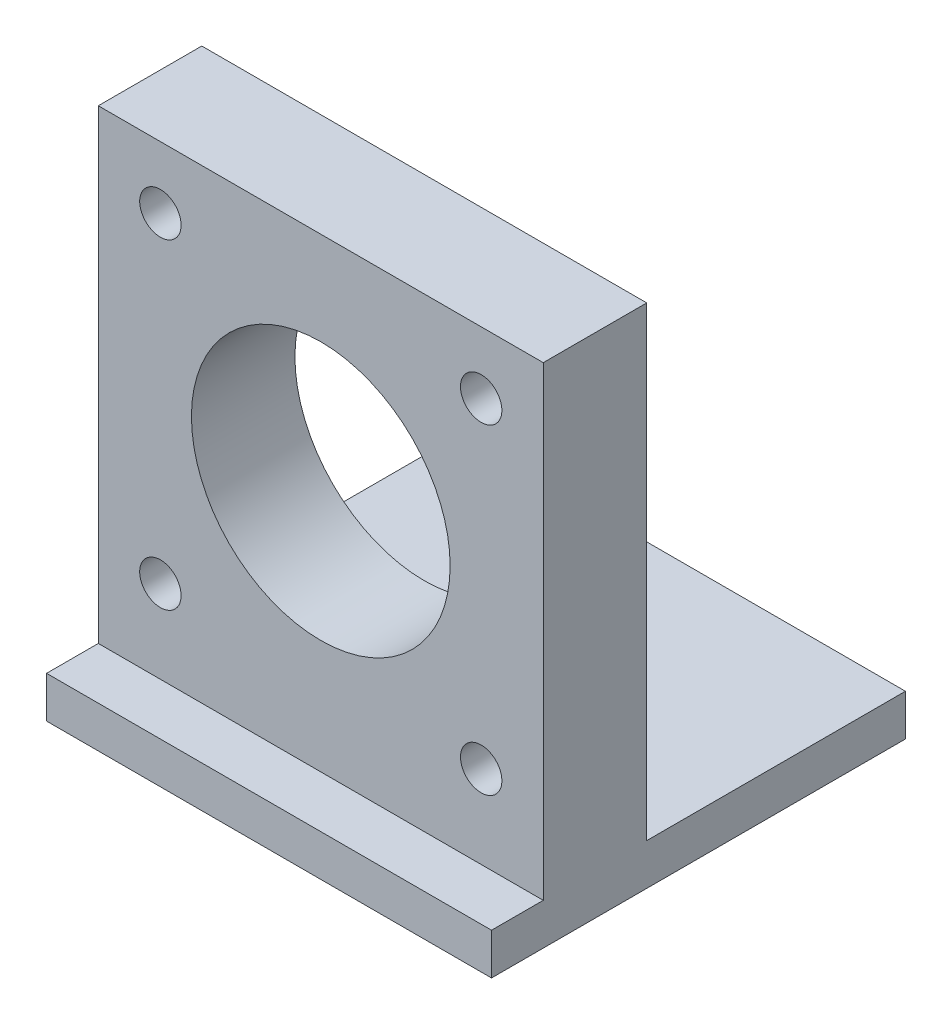
ISO-10303-21;
HEADER;
FILE_DESCRIPTION(('STEP AP214'),'2;1');
FILE_NAME('part.step','',(''),(''),'','','');
FILE_SCHEMA(('AUTOMOTIVE_DESIGN { 1 0 10303 214 1 1 1 1 }'));
ENDSEC;
DATA;
#1=APPLICATION_CONTEXT('core data for automotive mechanical design processes');
#2=APPLICATION_PROTOCOL_DEFINITION('international standard','automotive_design',2000,#1);
#3=PRODUCT_CONTEXT('',#1,'mechanical');
#4=PRODUCT('Part','Part','',(#3));
#5=PRODUCT_RELATED_PRODUCT_CATEGORY('part','',(#4));
#6=PRODUCT_DEFINITION_FORMATION('','',#4);
#7=PRODUCT_DEFINITION_CONTEXT('part definition',#1,'design');
#8=PRODUCT_DEFINITION('design','',#6,#7);
#9=PRODUCT_DEFINITION_SHAPE('','',#8);
#10=(LENGTH_UNIT() NAMED_UNIT(*) SI_UNIT(.MILLI.,.METRE.));
#11=(NAMED_UNIT(*) PLANE_ANGLE_UNIT() SI_UNIT($,.RADIAN.));
#12=(NAMED_UNIT(*) SI_UNIT($,.STERADIAN.) SOLID_ANGLE_UNIT());
#13=UNCERTAINTY_MEASURE_WITH_UNIT(LENGTH_MEASURE(1.E-05),#10,'distance_accuracy_value','');
#14=(GEOMETRIC_REPRESENTATION_CONTEXT(3) GLOBAL_UNCERTAINTY_ASSIGNED_CONTEXT((#13)) GLOBAL_UNIT_ASSIGNED_CONTEXT((#10,
#11,#12)) REPRESENTATION_CONTEXT('',''));
#15=CARTESIAN_POINT('',(0.,0.,0.));
#16=DIRECTION('',(0.,0.,1.));
#17=DIRECTION('',(1.,0.,0.));
#18=AXIS2_PLACEMENT_3D('',#15,#16,#17);
#19=CARTESIAN_POINT('',(0.,4.,0.));
#20=DIRECTION('',(0.,-1.,0.));
#21=DIRECTION('',(0.,0.,-1.));
#22=AXIS2_PLACEMENT_3D('',#19,#20,#21);
#23=PLANE('',#22);
#24=DIRECTION('',(-1.,0.,0.));
#25=VECTOR('',#24,1.);
#26=CARTESIAN_POINT('',(-27.0906484761589,4.,-0.669439574205802));
#27=LINE('',#26,#25);
#28=CARTESIAN_POINT('',(15.9093515238411,4.,-0.669439574205802));
#29=VERTEX_POINT('',#28);
#30=CARTESIAN_POINT('',(-27.0906484761589,4.,-0.669439574205802));
#31=VERTEX_POINT('',#30);
#32=EDGE_CURVE('E50',#29,#31,#27,.T.);
#33=ORIENTED_EDGE('',*,*,#32,.F.);
#34=DIRECTION('',(0.,0.,-1.));
#35=VECTOR('',#34,1.);
#36=CARTESIAN_POINT('',(15.9093515238411,4.,14.3305604257942));
#37=LINE('',#36,#35);
#38=CARTESIAN_POINT('',(15.9093515238411,4.,-25.6694395742058));
#39=VERTEX_POINT('',#38);
#40=EDGE_CURVE('E171',#29,#39,#37,.T.);
#41=ORIENTED_EDGE('',*,*,#40,.T.);
#42=DIRECTION('',(-1.,0.,0.));
#43=VECTOR('',#42,1.);
#44=CARTESIAN_POINT('',(-27.0906484761589,4.,-25.6694395742058));
#45=LINE('',#44,#43);
#46=CARTESIAN_POINT('',(-27.0906484761589,4.,-25.6694395742058));
#47=VERTEX_POINT('',#46);
#48=EDGE_CURVE('E161',#39,#47,#45,.T.);
#49=ORIENTED_EDGE('',*,*,#48,.T.);
#50=DIRECTION('',(0.,0.,1.));
#51=VECTOR('',#50,1.);
#52=CARTESIAN_POINT('',(-27.0906484761589,4.,14.3305604257942));
#53=LINE('',#52,#51);
#54=EDGE_CURVE('E151',#47,#31,#53,.T.);
#55=ORIENTED_EDGE('',*,*,#54,.T.);
#56=EDGE_LOOP('',(#33,#41,#49,#55));
#57=FACE_BOUND('',#56,.T.);
#58=ADVANCED_FACE('F33',(#57),#23,.F.);
#59=DIRECTION('',(1.,0.,0.));
#60=VECTOR('',#59,1.);
#61=CARTESIAN_POINT('',(-27.0906484761589,4.,9.3305604257942));
#62=LINE('',#61,#60);
#63=CARTESIAN_POINT('',(-27.0906484761589,4.,9.3305604257942));
#64=VERTEX_POINT('',#63);
#65=CARTESIAN_POINT('',(15.9093515238411,4.,9.3305604257942));
#66=VERTEX_POINT('',#65);
#67=EDGE_CURVE('E58',#64,#66,#62,.T.);
#68=ORIENTED_EDGE('',*,*,#67,.F.);
#69=CARTESIAN_POINT('',(-27.0906484761589,4.,14.3305604257942));
#70=VERTEX_POINT('',#69);
#71=EDGE_CURVE('E122',#64,#70,#53,.T.);
#72=ORIENTED_EDGE('',*,*,#71,.T.);
#73=DIRECTION('',(1.,0.,0.));
#74=VECTOR('',#73,1.);
#75=CARTESIAN_POINT('',(-27.0906484761589,4.,14.3305604257942));
#76=LINE('',#75,#74);
#77=CARTESIAN_POINT('',(15.9093515238411,4.,14.3305604257942));
#78=VERTEX_POINT('',#77);
#79=EDGE_CURVE('E145',#70,#78,#76,.T.);
#80=ORIENTED_EDGE('',*,*,#79,.T.);
#81=EDGE_CURVE('E167',#78,#66,#37,.T.);
#82=ORIENTED_EDGE('',*,*,#81,.T.);
#83=EDGE_LOOP('',(#68,#72,#80,#82));
#84=FACE_BOUND('',#83,.T.);
#85=ADVANCED_FACE('F177',(#84),#23,.F.);
#86=CARTESIAN_POINT('',(-27.0906484761589,4.,14.3305604257942));
#87=DIRECTION('',(1.,0.,0.));
#88=DIRECTION('',(0.,0.,-1.));
#89=AXIS2_PLACEMENT_3D('',#86,#87,#88);
#90=PLANE('',#89);
#91=DIRECTION('',(0.,0.,1.));
#92=VECTOR('',#91,1.);
#93=CARTESIAN_POINT('',(-27.0906484761589,0.,14.3305604257942));
#94=LINE('',#93,#92);
#95=CARTESIAN_POINT('',(-27.0906484761589,0.,-25.6694395742058));
#96=VERTEX_POINT('',#95);
#97=CARTESIAN_POINT('',(-27.0906484761589,0.,14.3305604257942));
#98=VERTEX_POINT('',#97);
#99=EDGE_CURVE('E123',#96,#98,#94,.T.);
#100=ORIENTED_EDGE('',*,*,#99,.T.);
#101=DIRECTION('',(0.,-1.,0.));
#102=VECTOR('',#101,1.);
#103=CARTESIAN_POINT('',(-27.0906484761589,4.,14.3305604257942));
#104=LINE('',#103,#102);
#105=EDGE_CURVE('E11',#70,#98,#104,.T.);
#106=ORIENTED_EDGE('',*,*,#105,.F.);
#107=ORIENTED_EDGE('',*,*,#71,.F.);
#108=DIRECTION('',(0.,-1.,0.));
#109=VECTOR('',#108,1.);
#110=CARTESIAN_POINT('',(-27.0906484761589,49.,9.3305604257942));
#111=LINE('',#110,#109);
#112=CARTESIAN_POINT('',(-27.0906484761589,49.,9.3305604257942));
#113=VERTEX_POINT('',#112);
#114=EDGE_CURVE('E104',#113,#64,#111,.T.);
#115=ORIENTED_EDGE('',*,*,#114,.F.);
#116=DIRECTION('',(0.,0.,1.));
#117=VECTOR('',#116,1.);
#118=CARTESIAN_POINT('',(-27.0906484761589,49.,-0.669439574205802));
#119=LINE('',#118,#117);
#120=CARTESIAN_POINT('',(-27.0906484761589,49.,-0.669439574205802));
#121=VERTEX_POINT('',#120);
#122=EDGE_CURVE('E110',#121,#113,#119,.T.);
#123=ORIENTED_EDGE('',*,*,#122,.F.);
#124=DIRECTION('',(0.,-1.,0.));
#125=VECTOR('',#124,1.);
#126=CARTESIAN_POINT('',(-27.0906484761589,49.,-0.669439574205802));
#127=LINE('',#126,#125);
#128=EDGE_CURVE('E136',#121,#31,#127,.T.);
#129=ORIENTED_EDGE('',*,*,#128,.T.);
#130=ORIENTED_EDGE('',*,*,#54,.F.);
#131=DIRECTION('',(0.,-1.,0.));
#132=VECTOR('',#131,1.);
#133=CARTESIAN_POINT('',(-27.0906484761589,4.,-25.6694395742058));
#134=LINE('',#133,#132);
#135=EDGE_CURVE('E158',#47,#96,#134,.T.);
#136=ORIENTED_EDGE('',*,*,#135,.T.);
#137=EDGE_LOOP('',(#100,#106,#107,#115,#123,#129,#130,#136));
#138=FACE_BOUND('',#137,.T.);
#139=ADVANCED_FACE('F35',(#138),#90,.F.);
#140=CARTESIAN_POINT('',(-27.0906484761589,4.,14.3305604257942));
#141=DIRECTION('',(0.,0.,-1.));
#142=DIRECTION('',(-1.,0.,0.));
#143=AXIS2_PLACEMENT_3D('',#140,#141,#142);
#144=PLANE('',#143);
#145=DIRECTION('',(1.,0.,0.));
#146=VECTOR('',#145,1.);
#147=CARTESIAN_POINT('',(-27.0906484761589,0.,14.3305604257942));
#148=LINE('',#147,#146);
#149=CARTESIAN_POINT('',(15.9093515238411,0.,14.3305604257942));
#150=VERTEX_POINT('',#149);
#151=EDGE_CURVE('E125',#98,#150,#148,.T.);
#152=ORIENTED_EDGE('',*,*,#151,.T.);
#153=DIRECTION('',(0.,-1.,0.));
#154=VECTOR('',#153,1.);
#155=CARTESIAN_POINT('',(15.9093515238411,4.,14.3305604257942));
#156=LINE('',#155,#154);
#157=EDGE_CURVE('E42',#78,#150,#156,.T.);
#158=ORIENTED_EDGE('',*,*,#157,.F.);
#159=ORIENTED_EDGE('',*,*,#79,.F.);
#160=ORIENTED_EDGE('',*,*,#105,.T.);
#161=EDGE_LOOP('',(#152,#158,#159,#160));
#162=FACE_BOUND('',#161,.T.);
#163=ADVANCED_FACE('F179',(#162),#144,.F.);
#164=CARTESIAN_POINT('',(15.9093515238411,4.,14.3305604257942));
#165=DIRECTION('',(-1.,0.,0.));
#166=DIRECTION('',(0.,0.,1.));
#167=AXIS2_PLACEMENT_3D('',#164,#165,#166);
#168=PLANE('',#167);
#169=DIRECTION('',(0.,0.,-1.));
#170=VECTOR('',#169,1.);
#171=CARTESIAN_POINT('',(15.9093515238411,0.,14.3305604257942));
#172=LINE('',#171,#170);
#173=CARTESIAN_POINT('',(15.9093515238411,0.,-25.6694395742058));
#174=VERTEX_POINT('',#173);
#175=EDGE_CURVE('E164',#150,#174,#172,.T.);
#176=ORIENTED_EDGE('',*,*,#175,.T.);
#177=DIRECTION('',(0.,-1.,0.));
#178=VECTOR('',#177,1.);
#179=CARTESIAN_POINT('',(15.9093515238411,4.,-25.6694395742058));
#180=LINE('',#179,#178);
#181=EDGE_CURVE('E155',#39,#174,#180,.T.);
#182=ORIENTED_EDGE('',*,*,#181,.F.);
#183=ORIENTED_EDGE('',*,*,#40,.F.);
#184=DIRECTION('',(0.,-1.,0.));
#185=VECTOR('',#184,1.);
#186=CARTESIAN_POINT('',(15.9093515238411,49.,-0.669439574205804));
#187=LINE('',#186,#185);
#188=CARTESIAN_POINT('',(15.9093515238411,49.,-0.669439574205804));
#189=VERTEX_POINT('',#188);
#190=EDGE_CURVE('E127',#189,#29,#187,.T.);
#191=ORIENTED_EDGE('',*,*,#190,.F.);
#192=DIRECTION('',(0.,0.,-1.));
#193=VECTOR('',#192,1.);
#194=CARTESIAN_POINT('',(15.9093515238411,49.,-0.669439574205804));
#195=LINE('',#194,#193);
#196=CARTESIAN_POINT('',(15.9093515238411,49.,9.3305604257942));
#197=VERTEX_POINT('',#196);
#198=EDGE_CURVE('E109',#197,#189,#195,.T.);
#199=ORIENTED_EDGE('',*,*,#198,.F.);
#200=DIRECTION('',(0.,-1.,0.));
#201=VECTOR('',#200,1.);
#202=CARTESIAN_POINT('',(15.9093515238411,49.,9.3305604257942));
#203=LINE('',#202,#201);
#204=EDGE_CURVE('E106',#197,#66,#203,.T.);
#205=ORIENTED_EDGE('',*,*,#204,.T.);
#206=ORIENTED_EDGE('',*,*,#81,.F.);
#207=ORIENTED_EDGE('',*,*,#157,.T.);
#208=EDGE_LOOP('',(#176,#182,#183,#191,#199,#205,#206,#207));
#209=FACE_BOUND('',#208,.T.);
#210=ADVANCED_FACE('F182',(#209),#168,.F.);
#211=CARTESIAN_POINT('',(-27.0906484761589,4.,-25.6694395742058));
#212=DIRECTION('',(0.,0.,1.));
#213=DIRECTION('',(1.,0.,0.));
#214=AXIS2_PLACEMENT_3D('',#211,#212,#213);
#215=PLANE('',#214);
#216=DIRECTION('',(-1.,0.,0.));
#217=VECTOR('',#216,1.);
#218=CARTESIAN_POINT('',(-27.0906484761589,0.,-25.6694395742058));
#219=LINE('',#218,#217);
#220=EDGE_CURVE('E162',#174,#96,#219,.T.);
#221=ORIENTED_EDGE('',*,*,#220,.T.);
#222=ORIENTED_EDGE('',*,*,#135,.F.);
#223=ORIENTED_EDGE('',*,*,#48,.F.);
#224=ORIENTED_EDGE('',*,*,#181,.T.);
#225=EDGE_LOOP('',(#221,#222,#223,#224));
#226=FACE_BOUND('',#225,.T.);
#227=ADVANCED_FACE('F251',(#226),#215,.F.);
#228=CARTESIAN_POINT('',(0.,0.,0.));
#229=DIRECTION('',(0.,-1.,0.));
#230=DIRECTION('',(0.,0.,-1.));
#231=AXIS2_PLACEMENT_3D('',#228,#229,#230);
#232=PLANE('',#231);
#233=ORIENTED_EDGE('',*,*,#99,.F.);
#234=ORIENTED_EDGE('',*,*,#220,.F.);
#235=ORIENTED_EDGE('',*,*,#175,.F.);
#236=ORIENTED_EDGE('',*,*,#151,.F.);
#237=EDGE_LOOP('',(#233,#234,#235,#236));
#238=FACE_BOUND('',#237,.T.);
#239=ADVANCED_FACE('F224',(#238),#232,.T.);
#240=CARTESIAN_POINT('',(-27.0906484761589,49.,9.3305604257942));
#241=DIRECTION('',(0.,0.,-1.));
#242=DIRECTION('',(-1.,0.,0.));
#243=AXIS2_PLACEMENT_3D('',#240,#241,#242);
#244=PLANE('',#243);
#245=CARTESIAN_POINT('',(-21.0906484761589,12.,9.3305604257942));
#246=DIRECTION('',(0.,0.,1.));
#247=DIRECTION('',(1.,0.,0.));
#248=AXIS2_PLACEMENT_3D('',#245,#246,#247);
#249=CIRCLE('',#248,2.);
#250=CARTESIAN_POINT('',(-19.0906484761589,12.,9.3305604257942));
#251=VERTEX_POINT('',#250);
#252=EDGE_CURVE('E214',#251,#251,#249,.T.);
#253=ORIENTED_EDGE('',*,*,#252,.F.);
#254=EDGE_LOOP('',(#253));
#255=FACE_BOUND('',#254,.T.);
#256=CARTESIAN_POINT('',(9.90935152384112,12.,9.3305604257942));
#257=DIRECTION('',(0.,0.,1.));
#258=DIRECTION('',(1.,0.,0.));
#259=AXIS2_PLACEMENT_3D('',#256,#257,#258);
#260=CIRCLE('',#259,2.);
#261=CARTESIAN_POINT('',(11.9093515238411,12.,9.3305604257942));
#262=VERTEX_POINT('',#261);
#263=EDGE_CURVE('E208',#262,#262,#260,.T.);
#264=ORIENTED_EDGE('',*,*,#263,.F.);
#265=EDGE_LOOP('',(#264));
#266=FACE_BOUND('',#265,.T.);
#267=CARTESIAN_POINT('',(9.90935152384112,43.,9.3305604257942));
#268=DIRECTION('',(0.,0.,1.));
#269=DIRECTION('',(1.,0.,0.));
#270=AXIS2_PLACEMENT_3D('',#267,#268,#269);
#271=CIRCLE('',#270,2.);
#272=CARTESIAN_POINT('',(11.9093515238411,43.,9.3305604257942));
#273=VERTEX_POINT('',#272);
#274=EDGE_CURVE('E202',#273,#273,#271,.T.);
#275=ORIENTED_EDGE('',*,*,#274,.F.);
#276=EDGE_LOOP('',(#275));
#277=FACE_BOUND('',#276,.T.);
#278=CARTESIAN_POINT('',(-21.0906484761589,43.,9.3305604257942));
#279=DIRECTION('',(0.,0.,1.));
#280=DIRECTION('',(1.,0.,0.));
#281=AXIS2_PLACEMENT_3D('',#278,#279,#280);
#282=CIRCLE('',#281,2.);
#283=CARTESIAN_POINT('',(-19.0906484761589,43.,9.3305604257942));
#284=VERTEX_POINT('',#283);
#285=EDGE_CURVE('E196',#284,#284,#282,.T.);
#286=ORIENTED_EDGE('',*,*,#285,.F.);
#287=EDGE_LOOP('',(#286));
#288=FACE_BOUND('',#287,.T.);
#289=CARTESIAN_POINT('',(-5.59064847615888,27.5,9.3305604257942));
#290=DIRECTION('',(0.,0.,1.));
#291=DIRECTION('',(1.,0.,0.));
#292=AXIS2_PLACEMENT_3D('',#289,#290,#291);
#293=CIRCLE('',#292,12.5);
#294=CARTESIAN_POINT('',(6.90935152384112,27.5,9.3305604257942));
#295=VERTEX_POINT('',#294);
#296=EDGE_CURVE('E190',#295,#295,#293,.T.);
#297=ORIENTED_EDGE('',*,*,#296,.F.);
#298=EDGE_LOOP('',(#297));
#299=FACE_BOUND('',#298,.T.);
#300=ORIENTED_EDGE('',*,*,#67,.T.);
#301=ORIENTED_EDGE('',*,*,#204,.F.);
#302=DIRECTION('',(1.,0.,0.));
#303=VECTOR('',#302,1.);
#304=CARTESIAN_POINT('',(-27.0906484761589,49.,9.3305604257942));
#305=LINE('',#304,#303);
#306=EDGE_CURVE('E100',#113,#197,#305,.T.);
#307=ORIENTED_EDGE('',*,*,#306,.F.);
#308=ORIENTED_EDGE('',*,*,#114,.T.);
#309=EDGE_LOOP('',(#300,#301,#307,#308));
#310=FACE_BOUND('',#309,.T.);
#311=ADVANCED_FACE('F102',(#255,#266,#277,#288,#299,#310),#244,.F.);
#312=CARTESIAN_POINT('',(-27.0906484761589,49.,-0.669439574205802));
#313=DIRECTION('',(0.,0.,1.));
#314=DIRECTION('',(1.,0.,0.));
#315=AXIS2_PLACEMENT_3D('',#312,#313,#314);
#316=PLANE('',#315);
#317=CARTESIAN_POINT('',(-21.0906484761589,12.,-0.669439574205802));
#318=DIRECTION('',(0.,0.,1.));
#319=DIRECTION('',(1.,0.,0.));
#320=AXIS2_PLACEMENT_3D('',#317,#318,#319);
#321=CIRCLE('',#320,2.);
#322=CARTESIAN_POINT('',(-19.0906484761589,12.,-0.669439574205802));
#323=VERTEX_POINT('',#322);
#324=EDGE_CURVE('E211',#323,#323,#321,.F.);
#325=ORIENTED_EDGE('',*,*,#324,.F.);
#326=EDGE_LOOP('',(#325));
#327=FACE_BOUND('',#326,.T.);
#328=CARTESIAN_POINT('',(9.90935152384112,12.,-0.669439574205802));
#329=DIRECTION('',(0.,0.,1.));
#330=DIRECTION('',(1.,0.,0.));
#331=AXIS2_PLACEMENT_3D('',#328,#329,#330);
#332=CIRCLE('',#331,2.);
#333=CARTESIAN_POINT('',(11.9093515238411,12.,-0.669439574205802));
#334=VERTEX_POINT('',#333);
#335=EDGE_CURVE('E205',#334,#334,#332,.F.);
#336=ORIENTED_EDGE('',*,*,#335,.F.);
#337=EDGE_LOOP('',(#336));
#338=FACE_BOUND('',#337,.T.);
#339=CARTESIAN_POINT('',(9.90935152384112,43.,-0.669439574205802));
#340=DIRECTION('',(0.,0.,1.));
#341=DIRECTION('',(1.,0.,0.));
#342=AXIS2_PLACEMENT_3D('',#339,#340,#341);
#343=CIRCLE('',#342,2.);
#344=CARTESIAN_POINT('',(11.9093515238411,43.,-0.669439574205802));
#345=VERTEX_POINT('',#344);
#346=EDGE_CURVE('E199',#345,#345,#343,.F.);
#347=ORIENTED_EDGE('',*,*,#346,.F.);
#348=EDGE_LOOP('',(#347));
#349=FACE_BOUND('',#348,.T.);
#350=CARTESIAN_POINT('',(-21.0906484761589,43.,-0.669439574205802));
#351=DIRECTION('',(0.,0.,1.));
#352=DIRECTION('',(1.,0.,0.));
#353=AXIS2_PLACEMENT_3D('',#350,#351,#352);
#354=CIRCLE('',#353,2.);
#355=CARTESIAN_POINT('',(-19.0906484761589,43.,-0.669439574205802));
#356=VERTEX_POINT('',#355);
#357=EDGE_CURVE('E193',#356,#356,#354,.F.);
#358=ORIENTED_EDGE('',*,*,#357,.F.);
#359=EDGE_LOOP('',(#358));
#360=FACE_BOUND('',#359,.T.);
#361=CARTESIAN_POINT('',(-5.59064847615888,27.5,-0.669439574205802));
#362=DIRECTION('',(0.,0.,1.));
#363=DIRECTION('',(1.,0.,0.));
#364=AXIS2_PLACEMENT_3D('',#361,#362,#363);
#365=CIRCLE('',#364,12.5);
#366=CARTESIAN_POINT('',(6.90935152384112,27.5,-0.669439574205802));
#367=VERTEX_POINT('',#366);
#368=EDGE_CURVE('E187',#367,#367,#365,.F.);
#369=ORIENTED_EDGE('',*,*,#368,.F.);
#370=EDGE_LOOP('',(#369));
#371=FACE_BOUND('',#370,.T.);
#372=ORIENTED_EDGE('',*,*,#32,.T.);
#373=ORIENTED_EDGE('',*,*,#128,.F.);
#374=DIRECTION('',(-1.,0.,0.));
#375=VECTOR('',#374,1.);
#376=CARTESIAN_POINT('',(-27.0906484761589,49.,-0.669439574205802));
#377=LINE('',#376,#375);
#378=EDGE_CURVE('E115',#189,#121,#377,.T.);
#379=ORIENTED_EDGE('',*,*,#378,.F.);
#380=ORIENTED_EDGE('',*,*,#190,.T.);
#381=EDGE_LOOP('',(#372,#373,#379,#380));
#382=FACE_BOUND('',#381,.T.);
#383=ADVANCED_FACE('F223',(#327,#338,#349,#360,#371,#382),#316,.F.);
#384=CARTESIAN_POINT('',(0.,49.,0.));
#385=DIRECTION('',(0.,1.,0.));
#386=DIRECTION('',(0.,0.,1.));
#387=AXIS2_PLACEMENT_3D('',#384,#385,#386);
#388=PLANE('',#387);
#389=ORIENTED_EDGE('',*,*,#122,.T.);
#390=ORIENTED_EDGE('',*,*,#306,.T.);
#391=ORIENTED_EDGE('',*,*,#198,.T.);
#392=ORIENTED_EDGE('',*,*,#378,.T.);
#393=EDGE_LOOP('',(#389,#390,#391,#392));
#394=FACE_BOUND('',#393,.T.);
#395=ADVANCED_FACE('F113',(#394),#388,.T.);
#396=CARTESIAN_POINT('',(-5.59064847615888,27.5,-25.6704645742058));
#397=DIRECTION('',(0.,0.,1.));
#398=DIRECTION('',(1.,0.,0.));
#399=AXIS2_PLACEMENT_3D('',#396,#397,#398);
#400=CYLINDRICAL_SURFACE('',#399,12.5);
#401=ORIENTED_EDGE('',*,*,#296,.T.);
#402=EDGE_LOOP('',(#401));
#403=FACE_BOUND('',#402,.T.);
#404=ORIENTED_EDGE('',*,*,#368,.T.);
#405=EDGE_LOOP('',(#404));
#406=FACE_BOUND('',#405,.T.);
#407=ADVANCED_FACE('F234',(#403,#406),#400,.F.);
#408=CARTESIAN_POINT('',(-21.0906484761589,43.,-25.6704645742058));
#409=DIRECTION('',(0.,0.,1.));
#410=DIRECTION('',(1.,0.,0.));
#411=AXIS2_PLACEMENT_3D('',#408,#409,#410);
#412=CYLINDRICAL_SURFACE('',#411,2.);
#413=ORIENTED_EDGE('',*,*,#285,.T.);
#414=EDGE_LOOP('',(#413));
#415=FACE_BOUND('',#414,.T.);
#416=ORIENTED_EDGE('',*,*,#357,.T.);
#417=EDGE_LOOP('',(#416));
#418=FACE_BOUND('',#417,.T.);
#419=ADVANCED_FACE('F237',(#415,#418),#412,.F.);
#420=CARTESIAN_POINT('',(9.90935152384112,43.,-25.6704645742058));
#421=DIRECTION('',(0.,0.,1.));
#422=DIRECTION('',(1.,0.,0.));
#423=AXIS2_PLACEMENT_3D('',#420,#421,#422);
#424=CYLINDRICAL_SURFACE('',#423,2.);
#425=ORIENTED_EDGE('',*,*,#274,.T.);
#426=EDGE_LOOP('',(#425));
#427=FACE_BOUND('',#426,.T.);
#428=ORIENTED_EDGE('',*,*,#346,.T.);
#429=EDGE_LOOP('',(#428));
#430=FACE_BOUND('',#429,.T.);
#431=ADVANCED_FACE('F270',(#427,#430),#424,.F.);
#432=CARTESIAN_POINT('',(9.90935152384112,12.,-25.6704645742058));
#433=DIRECTION('',(0.,0.,1.));
#434=DIRECTION('',(1.,0.,0.));
#435=AXIS2_PLACEMENT_3D('',#432,#433,#434);
#436=CYLINDRICAL_SURFACE('',#435,2.);
#437=ORIENTED_EDGE('',*,*,#263,.T.);
#438=EDGE_LOOP('',(#437));
#439=FACE_BOUND('',#438,.T.);
#440=ORIENTED_EDGE('',*,*,#335,.T.);
#441=EDGE_LOOP('',(#440));
#442=FACE_BOUND('',#441,.T.);
#443=ADVANCED_FACE('F274',(#439,#442),#436,.F.);
#444=CARTESIAN_POINT('',(-21.0906484761589,12.,-25.6704645742058));
#445=DIRECTION('',(0.,0.,1.));
#446=DIRECTION('',(1.,0.,0.));
#447=AXIS2_PLACEMENT_3D('',#444,#445,#446);
#448=CYLINDRICAL_SURFACE('',#447,2.);
#449=ORIENTED_EDGE('',*,*,#252,.T.);
#450=EDGE_LOOP('',(#449));
#451=FACE_BOUND('',#450,.T.);
#452=ORIENTED_EDGE('',*,*,#324,.T.);
#453=EDGE_LOOP('',(#452));
#454=FACE_BOUND('',#453,.T.);
#455=ADVANCED_FACE('F218',(#451,#454),#448,.F.);
#456=CLOSED_SHELL('',(#58,#85,#139,#163,#210,#227,#239,#311,#383,#395,#407,#419,#431,#443,#455));
#457=MANIFOLD_SOLID_BREP('B2',#456);
#458=ADVANCED_BREP_SHAPE_REPRESENTATION('',(#18,#457),#14);
#459=SHAPE_DEFINITION_REPRESENTATION(#9,#458);
ENDSEC;
END-ISO-10303-21;
